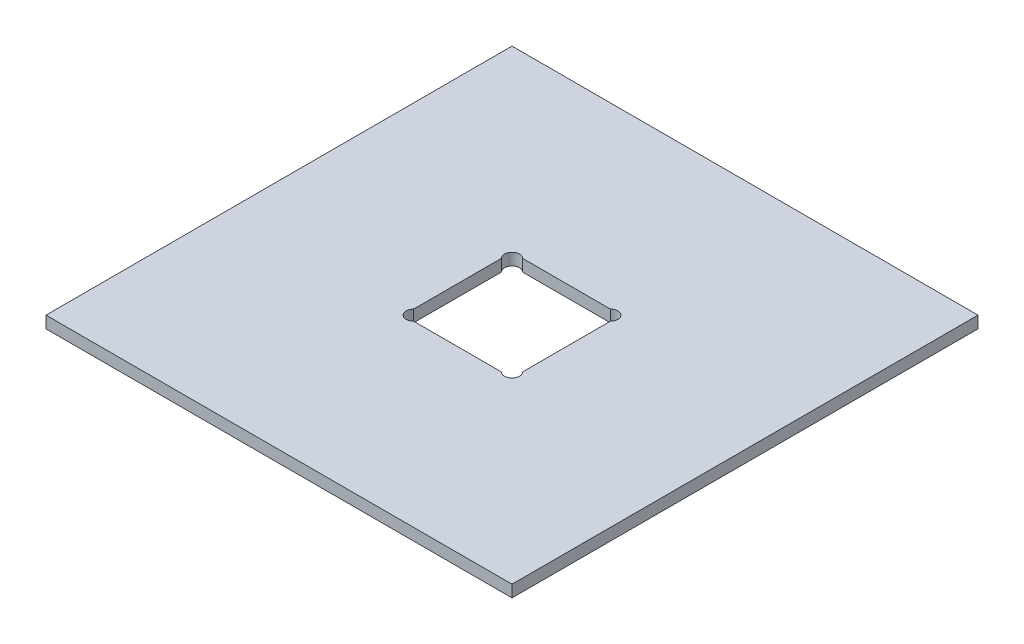
ISO-10303-21;
HEADER;
FILE_DESCRIPTION(('STEP AP214'),'2;1');
FILE_NAME('part.step','',(''),(''),'','','');
FILE_SCHEMA(('AUTOMOTIVE_DESIGN { 1 0 10303 214 1 1 1 1 }'));
ENDSEC;
DATA;
#1=APPLICATION_CONTEXT('core data for automotive mechanical design processes');
#2=APPLICATION_PROTOCOL_DEFINITION('international standard','automotive_design',2000,#1);
#3=PRODUCT_CONTEXT('',#1,'mechanical');
#4=PRODUCT('Part','Part','',(#3));
#5=PRODUCT_RELATED_PRODUCT_CATEGORY('part','',(#4));
#6=PRODUCT_DEFINITION_FORMATION('','',#4);
#7=PRODUCT_DEFINITION_CONTEXT('part definition',#1,'design');
#8=PRODUCT_DEFINITION('design','',#6,#7);
#9=PRODUCT_DEFINITION_SHAPE('','',#8);
#10=(LENGTH_UNIT() NAMED_UNIT(*) SI_UNIT(.MILLI.,.METRE.));
#11=(NAMED_UNIT(*) PLANE_ANGLE_UNIT() SI_UNIT($,.RADIAN.));
#12=(NAMED_UNIT(*) SI_UNIT($,.STERADIAN.) SOLID_ANGLE_UNIT());
#13=UNCERTAINTY_MEASURE_WITH_UNIT(LENGTH_MEASURE(1.E-05),#10,'distance_accuracy_value','');
#14=(GEOMETRIC_REPRESENTATION_CONTEXT(3) GLOBAL_UNCERTAINTY_ASSIGNED_CONTEXT((#13)) GLOBAL_UNIT_ASSIGNED_CONTEXT((#10,
#11,#12)) REPRESENTATION_CONTEXT('',''));
#15=CARTESIAN_POINT('',(0.,0.,0.));
#16=DIRECTION('',(0.,0.,1.));
#17=DIRECTION('',(1.,0.,0.));
#18=AXIS2_PLACEMENT_3D('',#15,#16,#17);
#19=CARTESIAN_POINT('',(31.3205865952532,1.6,31.3205865952534));
#20=DIRECTION('',(-1.,0.,0.));
#21=DIRECTION('',(0.,0.,1.));
#22=AXIS2_PLACEMENT_3D('',#19,#20,#21);
#23=PLANE('',#22);
#24=DIRECTION('',(0.,0.,-1.));
#25=VECTOR('',#24,1.);
#26=CARTESIAN_POINT('',(31.3205865952532,0.,31.3205865952534));
#27=LINE('',#26,#25);
#28=CARTESIAN_POINT('',(31.3205865952532,0.,31.3205865952534));
#29=VERTEX_POINT('',#28);
#30=CARTESIAN_POINT('',(31.3205865952532,0.,-31.3205865952534));
#31=VERTEX_POINT('',#30);
#32=EDGE_CURVE('E177',#29,#31,#27,.T.);
#33=ORIENTED_EDGE('',*,*,#32,.T.);
#34=DIRECTION('',(0.,-1.,0.));
#35=VECTOR('',#34,1.);
#36=CARTESIAN_POINT('',(31.3205865952532,1.6,-31.3205865952534));
#37=LINE('',#36,#35);
#38=CARTESIAN_POINT('',(31.3205865952532,1.6,-31.3205865952534));
#39=VERTEX_POINT('',#38);
#40=EDGE_CURVE('E11',#39,#31,#37,.T.);
#41=ORIENTED_EDGE('',*,*,#40,.F.);
#42=DIRECTION('',(0.,0.,-1.));
#43=VECTOR('',#42,1.);
#44=CARTESIAN_POINT('',(31.3205865952532,1.6,31.3205865952534));
#45=LINE('',#44,#43);
#46=CARTESIAN_POINT('',(31.3205865952532,1.6,31.3205865952534));
#47=VERTEX_POINT('',#46);
#48=EDGE_CURVE('E189',#47,#39,#45,.T.);
#49=ORIENTED_EDGE('',*,*,#48,.F.);
#50=DIRECTION('',(0.,-1.,0.));
#51=VECTOR('',#50,1.);
#52=CARTESIAN_POINT('',(31.3205865952532,1.6,31.3205865952534));
#53=LINE('',#52,#51);
#54=EDGE_CURVE('E199',#47,#29,#53,.T.);
#55=ORIENTED_EDGE('',*,*,#54,.T.);
#56=EDGE_LOOP('',(#33,#41,#49,#55));
#57=FACE_BOUND('',#56,.T.);
#58=ADVANCED_FACE('F32',(#57),#23,.F.);
#59=CARTESIAN_POINT('',(-31.3205865952532,1.6,-31.3205865952534));
#60=DIRECTION('',(0.,0.,1.));
#61=DIRECTION('',(1.,0.,0.));
#62=AXIS2_PLACEMENT_3D('',#59,#60,#61);
#63=PLANE('',#62);
#64=DIRECTION('',(-1.,0.,0.));
#65=VECTOR('',#64,1.);
#66=CARTESIAN_POINT('',(-31.3205865952532,0.,-31.3205865952534));
#67=LINE('',#66,#65);
#68=CARTESIAN_POINT('',(-31.3205865952532,0.,-31.3205865952534));
#69=VERTEX_POINT('',#68);
#70=EDGE_CURVE('E202',#31,#69,#67,.T.);
#71=ORIENTED_EDGE('',*,*,#70,.T.);
#72=DIRECTION('',(0.,-1.,0.));
#73=VECTOR('',#72,1.);
#74=CARTESIAN_POINT('',(-31.3205865952532,1.6,-31.3205865952534));
#75=LINE('',#74,#73);
#76=CARTESIAN_POINT('',(-31.3205865952532,1.6,-31.3205865952534));
#77=VERTEX_POINT('',#76);
#78=EDGE_CURVE('E39',#77,#69,#75,.T.);
#79=ORIENTED_EDGE('',*,*,#78,.F.);
#80=DIRECTION('',(-1.,0.,0.));
#81=VECTOR('',#80,1.);
#82=CARTESIAN_POINT('',(-31.3205865952532,1.6,-31.3205865952534));
#83=LINE('',#82,#81);
#84=EDGE_CURVE('E192',#39,#77,#83,.T.);
#85=ORIENTED_EDGE('',*,*,#84,.F.);
#86=ORIENTED_EDGE('',*,*,#40,.T.);
#87=EDGE_LOOP('',(#71,#79,#85,#86));
#88=FACE_BOUND('',#87,.T.);
#89=ADVANCED_FACE('F230',(#88),#63,.F.);
#90=CARTESIAN_POINT('',(-31.3205865952532,1.6,31.3205865952534));
#91=DIRECTION('',(1.,0.,0.));
#92=DIRECTION('',(0.,0.,-1.));
#93=AXIS2_PLACEMENT_3D('',#90,#91,#92);
#94=PLANE('',#93);
#95=DIRECTION('',(0.,0.,1.));
#96=VECTOR('',#95,1.);
#97=CARTESIAN_POINT('',(-31.3205865952532,0.,31.3205865952534));
#98=LINE('',#97,#96);
#99=CARTESIAN_POINT('',(-31.3205865952532,0.,31.3205865952534));
#100=VERTEX_POINT('',#99);
#101=EDGE_CURVE('E204',#69,#100,#98,.T.);
#102=ORIENTED_EDGE('',*,*,#101,.T.);
#103=DIRECTION('',(0.,-1.,0.));
#104=VECTOR('',#103,1.);
#105=CARTESIAN_POINT('',(-31.3205865952532,1.6,31.3205865952534));
#106=LINE('',#105,#104);
#107=CARTESIAN_POINT('',(-31.3205865952532,1.6,31.3205865952534));
#108=VERTEX_POINT('',#107);
#109=EDGE_CURVE('E209',#108,#100,#106,.T.);
#110=ORIENTED_EDGE('',*,*,#109,.F.);
#111=DIRECTION('',(0.,0.,1.));
#112=VECTOR('',#111,1.);
#113=CARTESIAN_POINT('',(-31.3205865952532,1.6,31.3205865952534));
#114=LINE('',#113,#112);
#115=EDGE_CURVE('E195',#77,#108,#114,.T.);
#116=ORIENTED_EDGE('',*,*,#115,.F.);
#117=ORIENTED_EDGE('',*,*,#78,.T.);
#118=EDGE_LOOP('',(#102,#110,#116,#117));
#119=FACE_BOUND('',#118,.T.);
#120=ADVANCED_FACE('F216',(#119),#94,.F.);
#121=CARTESIAN_POINT('',(-31.3205865952532,1.6,31.3205865952534));
#122=DIRECTION('',(0.,0.,-1.));
#123=DIRECTION('',(-1.,0.,0.));
#124=AXIS2_PLACEMENT_3D('',#121,#122,#123);
#125=PLANE('',#124);
#126=DIRECTION('',(1.,0.,0.));
#127=VECTOR('',#126,1.);
#128=CARTESIAN_POINT('',(-31.3205865952532,0.,31.3205865952534));
#129=LINE('',#128,#127);
#130=EDGE_CURVE('E193',#100,#29,#129,.T.);
#131=ORIENTED_EDGE('',*,*,#130,.T.);
#132=ORIENTED_EDGE('',*,*,#54,.F.);
#133=DIRECTION('',(1.,0.,0.));
#134=VECTOR('',#133,1.);
#135=CARTESIAN_POINT('',(-31.3205865952532,1.6,31.3205865952534));
#136=LINE('',#135,#134);
#137=EDGE_CURVE('E197',#108,#47,#136,.T.);
#138=ORIENTED_EDGE('',*,*,#137,.F.);
#139=ORIENTED_EDGE('',*,*,#109,.T.);
#140=EDGE_LOOP('',(#131,#132,#138,#139));
#141=FACE_BOUND('',#140,.T.);
#142=ADVANCED_FACE('F223',(#141),#125,.F.);
#143=CARTESIAN_POINT('',(0.,1.6,0.));
#144=DIRECTION('',(0.,-1.,0.));
#145=DIRECTION('',(0.,0.,-1.));
#146=AXIS2_PLACEMENT_3D('',#143,#144,#145);
#147=PLANE('',#146);
#148=DIRECTION('',(0.,0.,1.));
#149=VECTOR('',#148,1.);
#150=CARTESIAN_POINT('',(-7.32058659525322,1.6,5.90637303288009));
#151=LINE('',#150,#149);
#152=CARTESIAN_POINT('',(-7.32058659525322,1.6,-5.90637303288027));
#153=VERTEX_POINT('',#152);
#154=CARTESIAN_POINT('',(-7.32058659525322,1.6,5.90637303288009));
#155=VERTEX_POINT('',#154);
#156=EDGE_CURVE('E159',#153,#155,#151,.T.);
#157=ORIENTED_EDGE('',*,*,#156,.F.);
#158=CARTESIAN_POINT('',(-6.61347981406668,1.6,-6.61347981406682));
#159=DIRECTION('',(0.,1.,0.));
#160=DIRECTION('',(0.,0.,1.));
#161=AXIS2_PLACEMENT_3D('',#158,#159,#160);
#162=CIRCLE('',#161,1.);
#163=CARTESIAN_POINT('',(-5.90637303288014,1.6,-7.32058659525338));
#164=VERTEX_POINT('',#163);
#165=EDGE_CURVE('E46',#164,#153,#162,.T.);
#166=ORIENTED_EDGE('',*,*,#165,.F.);
#167=DIRECTION('',(-1.,0.,0.));
#168=VECTOR('',#167,1.);
#169=CARTESIAN_POINT('',(-5.90637303288014,1.6,-7.32058659525338));
#170=LINE('',#169,#168);
#171=CARTESIAN_POINT('',(5.9063730328803,1.6,-7.3205865952532));
#172=VERTEX_POINT('',#171);
#173=EDGE_CURVE('E139',#172,#164,#170,.T.);
#174=ORIENTED_EDGE('',*,*,#173,.F.);
#175=CARTESIAN_POINT('',(6.61347981406685,1.6,-6.61347981406665));
#176=DIRECTION('',(0.,1.,0.));
#177=DIRECTION('',(0.,0.,1.));
#178=AXIS2_PLACEMENT_3D('',#175,#176,#177);
#179=CIRCLE('',#178,1.);
#180=CARTESIAN_POINT('',(7.3205865952534,1.6,-5.90637303288011));
#181=VERTEX_POINT('',#180);
#182=EDGE_CURVE('E142',#181,#172,#179,.T.);
#183=ORIENTED_EDGE('',*,*,#182,.F.);
#184=DIRECTION('',(0.,0.,-1.));
#185=VECTOR('',#184,1.);
#186=CARTESIAN_POINT('',(7.3205865952534,1.6,-5.90637303288011));
#187=LINE('',#186,#185);
#188=CARTESIAN_POINT('',(7.32058659525333,1.6,5.90637303288006));
#189=VERTEX_POINT('',#188);
#190=EDGE_CURVE('E170',#189,#181,#187,.T.);
#191=ORIENTED_EDGE('',*,*,#190,.F.);
#192=CARTESIAN_POINT('',(6.61347981406679,1.6,6.61347981406662));
#193=DIRECTION('',(0.,1.,0.));
#194=DIRECTION('',(0.,0.,1.));
#195=AXIS2_PLACEMENT_3D('',#192,#193,#194);
#196=CIRCLE('',#195,1.);
#197=CARTESIAN_POINT('',(5.90637303288025,1.6,7.32058659525317));
#198=VERTEX_POINT('',#197);
#199=EDGE_CURVE('E167',#198,#189,#196,.T.);
#200=ORIENTED_EDGE('',*,*,#199,.F.);
#201=DIRECTION('',(1.,0.,0.));
#202=VECTOR('',#201,1.);
#203=CARTESIAN_POINT('',(5.90637303288025,1.6,7.32058659525318));
#204=LINE('',#203,#202);
#205=CARTESIAN_POINT('',(-5.90637303288011,1.6,7.32058659525317));
#206=VERTEX_POINT('',#205);
#207=EDGE_CURVE('E164',#206,#198,#204,.T.);
#208=ORIENTED_EDGE('',*,*,#207,.F.);
#209=CARTESIAN_POINT('',(-6.61347981406667,1.6,6.61347981406663));
#210=DIRECTION('',(0.,1.,0.));
#211=DIRECTION('',(0.,0.,1.));
#212=AXIS2_PLACEMENT_3D('',#209,#210,#211);
#213=CIRCLE('',#212,1.);
#214=EDGE_CURVE('E161',#155,#206,#213,.T.);
#215=ORIENTED_EDGE('',*,*,#214,.F.);
#216=EDGE_LOOP('',(#157,#166,#174,#183,#191,#200,#208,#215));
#217=FACE_BOUND('',#216,.T.);
#218=ORIENTED_EDGE('',*,*,#48,.T.);
#219=ORIENTED_EDGE('',*,*,#84,.T.);
#220=ORIENTED_EDGE('',*,*,#115,.T.);
#221=ORIENTED_EDGE('',*,*,#137,.T.);
#222=EDGE_LOOP('',(#218,#219,#220,#221));
#223=FACE_BOUND('',#222,.T.);
#224=ADVANCED_FACE('F229',(#217,#223),#147,.F.);
#225=CARTESIAN_POINT('',(0.,0.,0.));
#226=DIRECTION('',(0.,-1.,0.));
#227=DIRECTION('',(0.,0.,-1.));
#228=AXIS2_PLACEMENT_3D('',#225,#226,#227);
#229=PLANE('',#228);
#230=CARTESIAN_POINT('',(-6.61347981406668,0.,-6.61347981406682));
#231=DIRECTION('',(0.,1.,0.));
#232=DIRECTION('',(0.,0.,1.));
#233=AXIS2_PLACEMENT_3D('',#230,#231,#232);
#234=CIRCLE('',#233,1.);
#235=CARTESIAN_POINT('',(-5.90637303288014,0.,-7.32058659525338));
#236=VERTEX_POINT('',#235);
#237=CARTESIAN_POINT('',(-7.32058659525322,0.,-5.90637303288027));
#238=VERTEX_POINT('',#237);
#239=EDGE_CURVE('E122',#236,#238,#234,.T.);
#240=ORIENTED_EDGE('',*,*,#239,.T.);
#241=DIRECTION('',(0.,0.,1.));
#242=VECTOR('',#241,1.);
#243=CARTESIAN_POINT('',(-7.32058659525322,0.,5.90637303288009));
#244=LINE('',#243,#242);
#245=CARTESIAN_POINT('',(-7.32058659525322,0.,5.90637303288009));
#246=VERTEX_POINT('',#245);
#247=EDGE_CURVE('E131',#238,#246,#244,.T.);
#248=ORIENTED_EDGE('',*,*,#247,.T.);
#249=CARTESIAN_POINT('',(-6.61347981406667,0.,6.61347981406663));
#250=DIRECTION('',(0.,1.,0.));
#251=DIRECTION('',(0.,0.,1.));
#252=AXIS2_PLACEMENT_3D('',#249,#250,#251);
#253=CIRCLE('',#252,1.);
#254=CARTESIAN_POINT('',(-5.90637303288011,0.,7.32058659525317));
#255=VERTEX_POINT('',#254);
#256=EDGE_CURVE('E54',#246,#255,#253,.T.);
#257=ORIENTED_EDGE('',*,*,#256,.T.);
#258=DIRECTION('',(1.,0.,0.));
#259=VECTOR('',#258,1.);
#260=CARTESIAN_POINT('',(5.90637303288025,0.,7.32058659525318));
#261=LINE('',#260,#259);
#262=CARTESIAN_POINT('',(5.90637303288025,0.,7.32058659525317));
#263=VERTEX_POINT('',#262);
#264=EDGE_CURVE('E146',#255,#263,#261,.T.);
#265=ORIENTED_EDGE('',*,*,#264,.T.);
#266=CARTESIAN_POINT('',(6.61347981406679,0.,6.61347981406662));
#267=DIRECTION('',(0.,1.,0.));
#268=DIRECTION('',(0.,0.,1.));
#269=AXIS2_PLACEMENT_3D('',#266,#267,#268);
#270=CIRCLE('',#269,1.);
#271=CARTESIAN_POINT('',(7.32058659525333,0.,5.90637303288006));
#272=VERTEX_POINT('',#271);
#273=EDGE_CURVE('E149',#263,#272,#270,.T.);
#274=ORIENTED_EDGE('',*,*,#273,.T.);
#275=DIRECTION('',(0.,0.,-1.));
#276=VECTOR('',#275,1.);
#277=CARTESIAN_POINT('',(7.3205865952534,0.,-5.90637303288011));
#278=LINE('',#277,#276);
#279=CARTESIAN_POINT('',(7.3205865952534,0.,-5.90637303288011));
#280=VERTEX_POINT('',#279);
#281=EDGE_CURVE('E152',#272,#280,#278,.T.);
#282=ORIENTED_EDGE('',*,*,#281,.T.);
#283=CARTESIAN_POINT('',(6.61347981406685,0.,-6.61347981406665));
#284=DIRECTION('',(0.,1.,0.));
#285=DIRECTION('',(0.,0.,1.));
#286=AXIS2_PLACEMENT_3D('',#283,#284,#285);
#287=CIRCLE('',#286,1.);
#288=CARTESIAN_POINT('',(5.9063730328803,0.,-7.3205865952532));
#289=VERTEX_POINT('',#288);
#290=EDGE_CURVE('E155',#280,#289,#287,.T.);
#291=ORIENTED_EDGE('',*,*,#290,.T.);
#292=DIRECTION('',(-1.,0.,0.));
#293=VECTOR('',#292,1.);
#294=CARTESIAN_POINT('',(-5.90637303288014,0.,-7.32058659525338));
#295=LINE('',#294,#293);
#296=EDGE_CURVE('E128',#289,#236,#295,.T.);
#297=ORIENTED_EDGE('',*,*,#296,.T.);
#298=EDGE_LOOP('',(#240,#248,#257,#265,#274,#282,#291,#297));
#299=FACE_BOUND('',#298,.T.);
#300=ORIENTED_EDGE('',*,*,#32,.F.);
#301=ORIENTED_EDGE('',*,*,#130,.F.);
#302=ORIENTED_EDGE('',*,*,#101,.F.);
#303=ORIENTED_EDGE('',*,*,#70,.F.);
#304=EDGE_LOOP('',(#300,#301,#302,#303));
#305=FACE_BOUND('',#304,.T.);
#306=ADVANCED_FACE('F135',(#299,#305),#229,.T.);
#307=CARTESIAN_POINT('',(-6.61347981406668,0.,-6.61347981406682));
#308=DIRECTION('',(0.,1.,0.));
#309=DIRECTION('',(0.,0.,1.));
#310=AXIS2_PLACEMENT_3D('',#307,#308,#309);
#311=CYLINDRICAL_SURFACE('',#310,1.);
#312=ORIENTED_EDGE('',*,*,#165,.T.);
#313=DIRECTION('',(0.,1.,0.));
#314=VECTOR('',#313,1.);
#315=CARTESIAN_POINT('',(-7.32058659525322,0.,-5.90637303288027));
#316=LINE('',#315,#314);
#317=EDGE_CURVE('E118',#238,#153,#316,.T.);
#318=ORIENTED_EDGE('',*,*,#317,.F.);
#319=ORIENTED_EDGE('',*,*,#239,.F.);
#320=DIRECTION('',(0.,1.,0.));
#321=VECTOR('',#320,1.);
#322=CARTESIAN_POINT('',(-5.90637303288014,0.,-7.32058659525338));
#323=LINE('',#322,#321);
#324=EDGE_CURVE('E175',#236,#164,#323,.T.);
#325=ORIENTED_EDGE('',*,*,#324,.T.);
#326=EDGE_LOOP('',(#312,#318,#319,#325));
#327=FACE_BOUND('',#326,.T.);
#328=ADVANCED_FACE('F120',(#327),#311,.F.);
#329=CARTESIAN_POINT('',(-5.90637303288014,0.,-7.32058659525338));
#330=DIRECTION('',(0.,0.,-1.));
#331=DIRECTION('',(-1.,0.,0.));
#332=AXIS2_PLACEMENT_3D('',#329,#330,#331);
#333=PLANE('',#332);
#334=ORIENTED_EDGE('',*,*,#173,.T.);
#335=ORIENTED_EDGE('',*,*,#324,.F.);
#336=ORIENTED_EDGE('',*,*,#296,.F.);
#337=DIRECTION('',(0.,1.,0.));
#338=VECTOR('',#337,1.);
#339=CARTESIAN_POINT('',(5.9063730328803,0.,-7.3205865952532));
#340=LINE('',#339,#338);
#341=EDGE_CURVE('E178',#289,#172,#340,.T.);
#342=ORIENTED_EDGE('',*,*,#341,.T.);
#343=EDGE_LOOP('',(#334,#335,#336,#342));
#344=FACE_BOUND('',#343,.T.);
#345=ADVANCED_FACE('F247',(#344),#333,.F.);
#346=CARTESIAN_POINT('',(6.61347981406685,0.,-6.61347981406665));
#347=DIRECTION('',(0.,1.,0.));
#348=DIRECTION('',(0.,0.,1.));
#349=AXIS2_PLACEMENT_3D('',#346,#347,#348);
#350=CYLINDRICAL_SURFACE('',#349,1.);
#351=ORIENTED_EDGE('',*,*,#182,.T.);
#352=ORIENTED_EDGE('',*,*,#341,.F.);
#353=ORIENTED_EDGE('',*,*,#290,.F.);
#354=DIRECTION('',(0.,1.,0.));
#355=VECTOR('',#354,1.);
#356=CARTESIAN_POINT('',(7.3205865952534,0.,-5.90637303288011));
#357=LINE('',#356,#355);
#358=EDGE_CURVE('E180',#280,#181,#357,.T.);
#359=ORIENTED_EDGE('',*,*,#358,.T.);
#360=EDGE_LOOP('',(#351,#352,#353,#359));
#361=FACE_BOUND('',#360,.T.);
#362=ADVANCED_FACE('F264',(#361),#350,.F.);
#363=CARTESIAN_POINT('',(7.3205865952534,0.,-5.90637303288011));
#364=DIRECTION('',(1.,0.,0.));
#365=DIRECTION('',(0.,0.,-1.));
#366=AXIS2_PLACEMENT_3D('',#363,#364,#365);
#367=PLANE('',#366);
#368=ORIENTED_EDGE('',*,*,#190,.T.);
#369=ORIENTED_EDGE('',*,*,#358,.F.);
#370=ORIENTED_EDGE('',*,*,#281,.F.);
#371=DIRECTION('',(0.,1.,0.));
#372=VECTOR('',#371,1.);
#373=CARTESIAN_POINT('',(7.32058659525333,0.,5.90637303288006));
#374=LINE('',#373,#372);
#375=EDGE_CURVE('E182',#272,#189,#374,.T.);
#376=ORIENTED_EDGE('',*,*,#375,.T.);
#377=EDGE_LOOP('',(#368,#369,#370,#376));
#378=FACE_BOUND('',#377,.T.);
#379=ADVANCED_FACE('F260',(#378),#367,.F.);
#380=CARTESIAN_POINT('',(6.61347981406679,0.,6.61347981406662));
#381=DIRECTION('',(0.,1.,0.));
#382=DIRECTION('',(0.,0.,1.));
#383=AXIS2_PLACEMENT_3D('',#380,#381,#382);
#384=CYLINDRICAL_SURFACE('',#383,1.);
#385=ORIENTED_EDGE('',*,*,#199,.T.);
#386=ORIENTED_EDGE('',*,*,#375,.F.);
#387=ORIENTED_EDGE('',*,*,#273,.F.);
#388=DIRECTION('',(0.,1.,0.));
#389=VECTOR('',#388,1.);
#390=CARTESIAN_POINT('',(5.90637303288025,0.,7.32058659525317));
#391=LINE('',#390,#389);
#392=EDGE_CURVE('E184',#263,#198,#391,.T.);
#393=ORIENTED_EDGE('',*,*,#392,.T.);
#394=EDGE_LOOP('',(#385,#386,#387,#393));
#395=FACE_BOUND('',#394,.T.);
#396=ADVANCED_FACE('F256',(#395),#384,.F.);
#397=CARTESIAN_POINT('',(5.90637303288025,0.,7.32058659525318));
#398=DIRECTION('',(0.,0.,1.));
#399=DIRECTION('',(1.,0.,0.));
#400=AXIS2_PLACEMENT_3D('',#397,#398,#399);
#401=PLANE('',#400);
#402=ORIENTED_EDGE('',*,*,#207,.T.);
#403=ORIENTED_EDGE('',*,*,#392,.F.);
#404=ORIENTED_EDGE('',*,*,#264,.F.);
#405=DIRECTION('',(0.,1.,0.));
#406=VECTOR('',#405,1.);
#407=CARTESIAN_POINT('',(-5.90637303288011,0.,7.32058659525317));
#408=LINE('',#407,#406);
#409=EDGE_CURVE('E186',#255,#206,#408,.T.);
#410=ORIENTED_EDGE('',*,*,#409,.T.);
#411=EDGE_LOOP('',(#402,#403,#404,#410));
#412=FACE_BOUND('',#411,.T.);
#413=ADVANCED_FACE('F253',(#412),#401,.F.);
#414=CARTESIAN_POINT('',(-6.61347981406667,0.,6.61347981406663));
#415=DIRECTION('',(0.,1.,0.));
#416=DIRECTION('',(0.,0.,1.));
#417=AXIS2_PLACEMENT_3D('',#414,#415,#416);
#418=CYLINDRICAL_SURFACE('',#417,1.);
#419=ORIENTED_EDGE('',*,*,#214,.T.);
#420=ORIENTED_EDGE('',*,*,#409,.F.);
#421=ORIENTED_EDGE('',*,*,#256,.F.);
#422=DIRECTION('',(0.,1.,0.));
#423=VECTOR('',#422,1.);
#424=CARTESIAN_POINT('',(-7.32058659525322,0.,5.90637303288009));
#425=LINE('',#424,#423);
#426=EDGE_CURVE('E127',#246,#155,#425,.T.);
#427=ORIENTED_EDGE('',*,*,#426,.T.);
#428=EDGE_LOOP('',(#419,#420,#421,#427));
#429=FACE_BOUND('',#428,.T.);
#430=ADVANCED_FACE('F250',(#429),#418,.F.);
#431=CARTESIAN_POINT('',(-7.32058659525322,0.,5.90637303288009));
#432=DIRECTION('',(-1.,0.,0.));
#433=DIRECTION('',(0.,0.,1.));
#434=AXIS2_PLACEMENT_3D('',#431,#432,#433);
#435=PLANE('',#434);
#436=ORIENTED_EDGE('',*,*,#156,.T.);
#437=ORIENTED_EDGE('',*,*,#426,.F.);
#438=ORIENTED_EDGE('',*,*,#247,.F.);
#439=ORIENTED_EDGE('',*,*,#317,.T.);
#440=EDGE_LOOP('',(#436,#437,#438,#439));
#441=FACE_BOUND('',#440,.T.);
#442=ADVANCED_FACE('F132',(#441),#435,.F.);
#443=CLOSED_SHELL('',(#58,#89,#120,#142,#224,#306,#328,#345,#362,#379,#396,#413,#430,#442));
#444=MANIFOLD_SOLID_BREP('B2',#443);
#445=ADVANCED_BREP_SHAPE_REPRESENTATION('',(#18,#444),#14);
#446=SHAPE_DEFINITION_REPRESENTATION(#9,#445);
ENDSEC;
END-ISO-10303-21;
